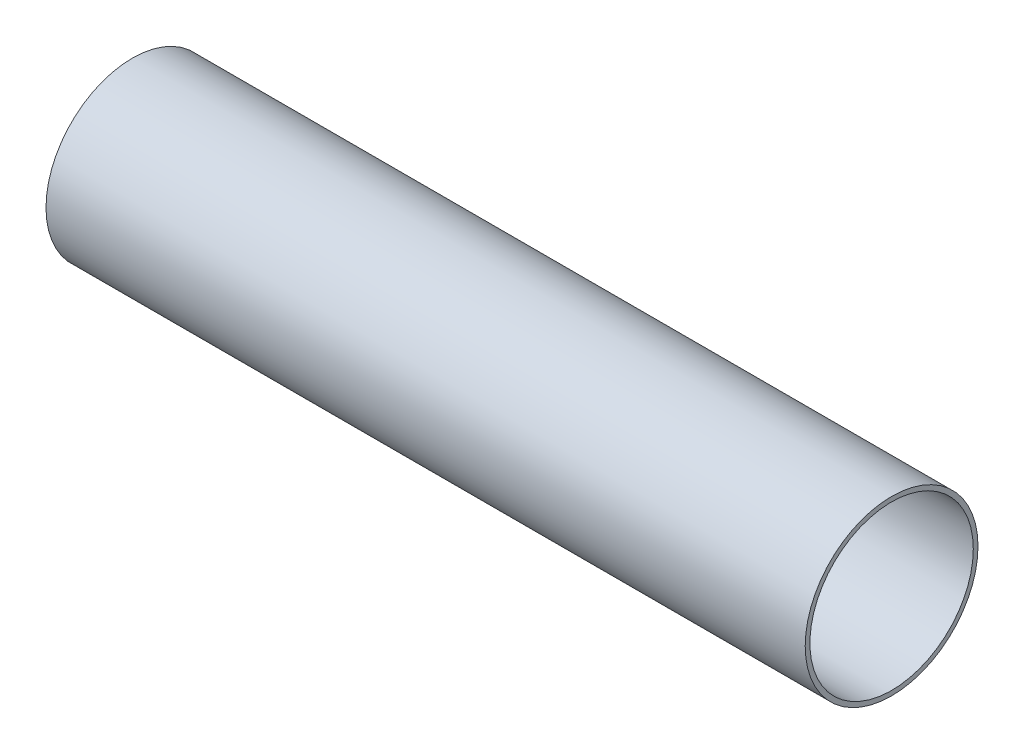
ISO-10303-21;
HEADER;
FILE_DESCRIPTION(('STEP AP214'),'2;1');
FILE_NAME('part.step','',(''),(''),'','','');
FILE_SCHEMA(('AUTOMOTIVE_DESIGN { 1 0 10303 214 1 1 1 1 }'));
ENDSEC;
DATA;
#1=APPLICATION_CONTEXT('core data for automotive mechanical design processes');
#2=APPLICATION_PROTOCOL_DEFINITION('international standard','automotive_design',2000,#1);
#3=PRODUCT_CONTEXT('',#1,'mechanical');
#4=PRODUCT('Part','Part','',(#3));
#5=PRODUCT_RELATED_PRODUCT_CATEGORY('part','',(#4));
#6=PRODUCT_DEFINITION_FORMATION('','',#4);
#7=PRODUCT_DEFINITION_CONTEXT('part definition',#1,'design');
#8=PRODUCT_DEFINITION('design','',#6,#7);
#9=PRODUCT_DEFINITION_SHAPE('','',#8);
#10=(LENGTH_UNIT() NAMED_UNIT(*) SI_UNIT(.MILLI.,.METRE.));
#11=(NAMED_UNIT(*) PLANE_ANGLE_UNIT() SI_UNIT($,.RADIAN.));
#12=(NAMED_UNIT(*) SI_UNIT($,.STERADIAN.) SOLID_ANGLE_UNIT());
#13=UNCERTAINTY_MEASURE_WITH_UNIT(LENGTH_MEASURE(1.E-05),#10,'distance_accuracy_value','');
#14=(GEOMETRIC_REPRESENTATION_CONTEXT(3) GLOBAL_UNCERTAINTY_ASSIGNED_CONTEXT((#13)) GLOBAL_UNIT_ASSIGNED_CONTEXT((#10,
#11,#12)) REPRESENTATION_CONTEXT('',''));
#15=CARTESIAN_POINT('',(0.,0.,0.));
#16=DIRECTION('',(0.,0.,1.));
#17=DIRECTION('',(1.,0.,0.));
#18=AXIS2_PLACEMENT_3D('',#15,#16,#17);
#19=CARTESIAN_POINT('',(254.,0.,0.));
#20=DIRECTION('',(1.,0.,0.));
#21=DIRECTION('',(0.,0.,-1.));
#22=AXIS2_PLACEMENT_3D('',#19,#20,#21);
#23=PLANE('',#22);
#24=CARTESIAN_POINT('',(254.,0.,0.));
#25=DIRECTION('',(1.,0.,0.));
#26=DIRECTION('',(0.,0.,-1.));
#27=AXIS2_PLACEMENT_3D('',#24,#25,#26);
#28=CIRCLE('',#27,28.9052);
#29=CARTESIAN_POINT('',(254.,0.,-28.9052));
#30=VERTEX_POINT('',#29);
#31=EDGE_CURVE('E10',#30,#30,#28,.T.);
#32=ORIENTED_EDGE('',*,*,#31,.T.);
#33=EDGE_LOOP('',(#32));
#34=FACE_BOUND('',#33,.T.);
#35=CARTESIAN_POINT('',(254.,0.,0.));
#36=DIRECTION('',(1.,0.,0.));
#37=DIRECTION('',(0.,0.,-1.));
#38=AXIS2_PLACEMENT_3D('',#35,#36,#37);
#39=CIRCLE('',#38,27.3304);
#40=CARTESIAN_POINT('',(254.,0.,-27.3304));
#41=VERTEX_POINT('',#40);
#42=EDGE_CURVE('E56',#41,#41,#39,.T.);
#43=ORIENTED_EDGE('',*,*,#42,.F.);
#44=EDGE_LOOP('',(#43));
#45=FACE_BOUND('',#44,.T.);
#46=ADVANCED_FACE('F43',(#34,#45),#23,.T.);
#47=CARTESIAN_POINT('',(0.,0.,0.));
#48=DIRECTION('',(1.,0.,0.));
#49=DIRECTION('',(0.,0.,-1.));
#50=AXIS2_PLACEMENT_3D('',#47,#48,#49);
#51=PLANE('',#50);
#52=CARTESIAN_POINT('',(0.,0.,0.));
#53=DIRECTION('',(1.,0.,0.));
#54=DIRECTION('',(0.,0.,-1.));
#55=AXIS2_PLACEMENT_3D('',#52,#53,#54);
#56=CIRCLE('',#55,28.9052);
#57=CARTESIAN_POINT('',(0.,0.,-28.9052));
#58=VERTEX_POINT('',#57);
#59=EDGE_CURVE('E47',#58,#58,#56,.T.);
#60=ORIENTED_EDGE('',*,*,#59,.F.);
#61=EDGE_LOOP('',(#60));
#62=FACE_BOUND('',#61,.T.);
#63=CARTESIAN_POINT('',(0.,0.,0.));
#64=DIRECTION('',(1.,0.,0.));
#65=DIRECTION('',(0.,0.,-1.));
#66=AXIS2_PLACEMENT_3D('',#63,#64,#65);
#67=CIRCLE('',#66,27.3304);
#68=CARTESIAN_POINT('',(0.,0.,-27.3304));
#69=VERTEX_POINT('',#68);
#70=EDGE_CURVE('E58',#69,#69,#67,.T.);
#71=ORIENTED_EDGE('',*,*,#70,.T.);
#72=EDGE_LOOP('',(#71));
#73=FACE_BOUND('',#72,.T.);
#74=ADVANCED_FACE('F70',(#62,#73),#51,.F.);
#75=CARTESIAN_POINT('',(254.,0.,0.));
#76=DIRECTION('',(-1.,0.,0.));
#77=DIRECTION('',(0.,0.,1.));
#78=AXIS2_PLACEMENT_3D('',#75,#76,#77);
#79=CYLINDRICAL_SURFACE('',#78,28.9052);
#80=ORIENTED_EDGE('',*,*,#31,.F.);
#81=EDGE_LOOP('',(#80));
#82=FACE_BOUND('',#81,.T.);
#83=ORIENTED_EDGE('',*,*,#59,.T.);
#84=EDGE_LOOP('',(#83));
#85=FACE_BOUND('',#84,.T.);
#86=ADVANCED_FACE('F45',(#82,#85),#79,.T.);
#87=CARTESIAN_POINT('',(254.,0.,0.));
#88=DIRECTION('',(-1.,0.,0.));
#89=DIRECTION('',(0.,0.,1.));
#90=AXIS2_PLACEMENT_3D('',#87,#88,#89);
#91=CYLINDRICAL_SURFACE('',#90,27.3304);
#92=ORIENTED_EDGE('',*,*,#42,.T.);
#93=EDGE_LOOP('',(#92));
#94=FACE_BOUND('',#93,.T.);
#95=ORIENTED_EDGE('',*,*,#70,.F.);
#96=EDGE_LOOP('',(#95));
#97=FACE_BOUND('',#96,.T.);
#98=ADVANCED_FACE('F66',(#94,#97),#91,.F.);
#99=CLOSED_SHELL('',(#46,#74,#86,#98));
#100=MANIFOLD_SOLID_BREP('B2',#99);
#101=ADVANCED_BREP_SHAPE_REPRESENTATION('',(#18,#100),#14);
#102=SHAPE_DEFINITION_REPRESENTATION(#9,#101);
ENDSEC;
END-ISO-10303-21;
